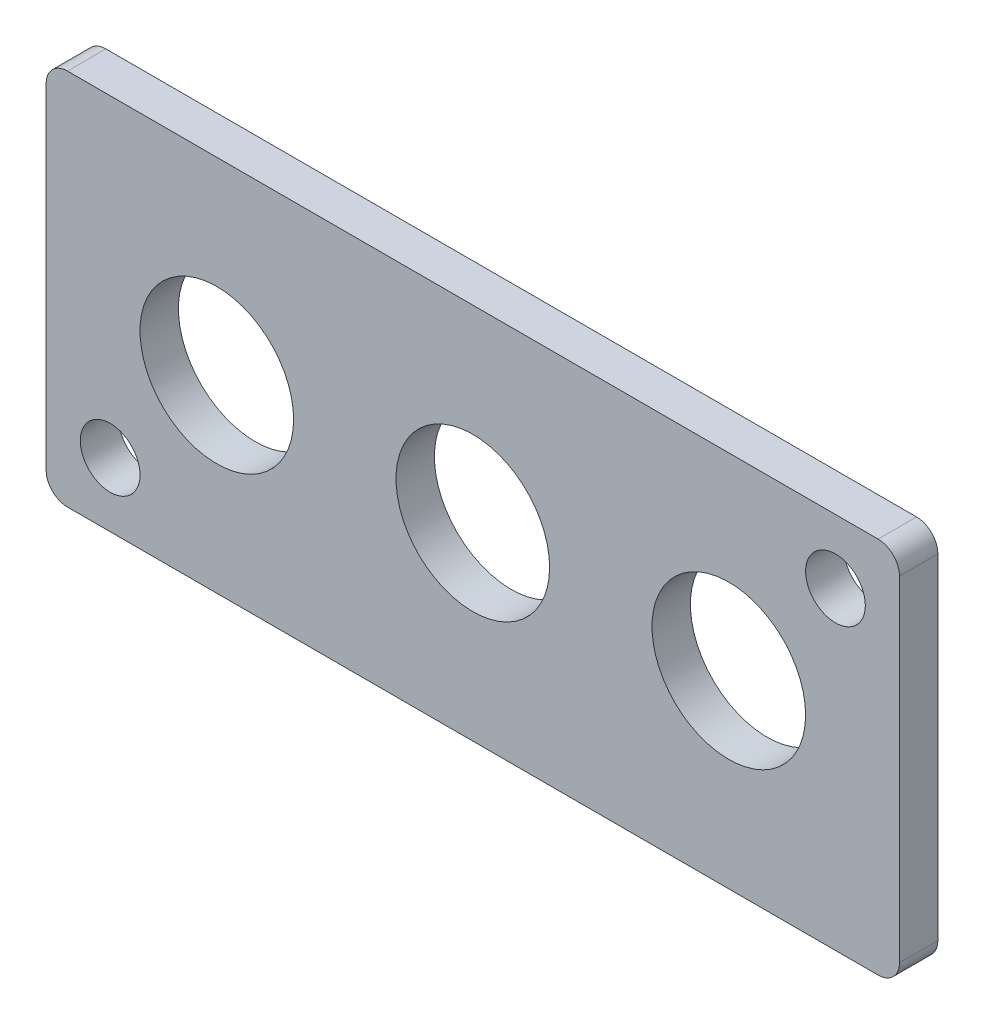
ISO-10303-21;
HEADER;
FILE_DESCRIPTION(('STEP AP214'),'2;1');
FILE_NAME('part.step','',(''),(''),'','','');
FILE_SCHEMA(('AUTOMOTIVE_DESIGN { 1 0 10303 214 1 1 1 1 }'));
ENDSEC;
DATA;
#1=APPLICATION_CONTEXT('core data for automotive mechanical design processes');
#2=APPLICATION_PROTOCOL_DEFINITION('international standard','automotive_design',2000,#1);
#3=PRODUCT_CONTEXT('',#1,'mechanical');
#4=PRODUCT('Part','Part','',(#3));
#5=PRODUCT_RELATED_PRODUCT_CATEGORY('part','',(#4));
#6=PRODUCT_DEFINITION_FORMATION('','',#4);
#7=PRODUCT_DEFINITION_CONTEXT('part definition',#1,'design');
#8=PRODUCT_DEFINITION('design','',#6,#7);
#9=PRODUCT_DEFINITION_SHAPE('','',#8);
#10=(LENGTH_UNIT() NAMED_UNIT(*) SI_UNIT(.MILLI.,.METRE.));
#11=(NAMED_UNIT(*) PLANE_ANGLE_UNIT() SI_UNIT($,.RADIAN.));
#12=(NAMED_UNIT(*) SI_UNIT($,.STERADIAN.) SOLID_ANGLE_UNIT());
#13=UNCERTAINTY_MEASURE_WITH_UNIT(LENGTH_MEASURE(1.E-05),#10,'distance_accuracy_value','');
#14=(GEOMETRIC_REPRESENTATION_CONTEXT(3) GLOBAL_UNCERTAINTY_ASSIGNED_CONTEXT((#13)) GLOBAL_UNIT_ASSIGNED_CONTEXT((#10,
#11,#12)) REPRESENTATION_CONTEXT('',''));
#15=CARTESIAN_POINT('',(0.,0.,0.));
#16=DIRECTION('',(0.,0.,1.));
#17=DIRECTION('',(1.,0.,0.));
#18=AXIS2_PLACEMENT_3D('',#15,#16,#17);
#19=CARTESIAN_POINT('',(52.,46.5,35.6));
#20=DIRECTION('',(0.,0.,-1.));
#21=DIRECTION('',(-1.,0.,0.));
#22=AXIS2_PLACEMENT_3D('',#19,#20,#21);
#23=CYLINDRICAL_SURFACE('',#22,1.);
#24=CARTESIAN_POINT('',(52.,46.5,33.8));
#25=DIRECTION('',(0.,0.,1.));
#26=DIRECTION('',(1.,0.,0.));
#27=AXIS2_PLACEMENT_3D('',#24,#25,#26);
#28=CIRCLE('',#27,1.);
#29=CARTESIAN_POINT('',(51.,46.5,33.8));
#30=VERTEX_POINT('',#29);
#31=CARTESIAN_POINT('',(52.,45.5,33.8));
#32=VERTEX_POINT('',#31);
#33=EDGE_CURVE('E136',#30,#32,#28,.T.);
#34=ORIENTED_EDGE('',*,*,#33,.T.);
#35=DIRECTION('',(0.,0.,-1.));
#36=VECTOR('',#35,1.);
#37=CARTESIAN_POINT('',(52.,45.5,35.6));
#38=LINE('',#37,#36);
#39=CARTESIAN_POINT('',(52.,45.5,35.6));
#40=VERTEX_POINT('',#39);
#41=EDGE_CURVE('E11',#40,#32,#38,.T.);
#42=ORIENTED_EDGE('',*,*,#41,.F.);
#43=CARTESIAN_POINT('',(52.,46.5,35.6));
#44=DIRECTION('',(0.,0.,1.));
#45=DIRECTION('',(1.,0.,0.));
#46=AXIS2_PLACEMENT_3D('',#43,#44,#45);
#47=CIRCLE('',#46,1.);
#48=CARTESIAN_POINT('',(51.,46.5,35.6));
#49=VERTEX_POINT('',#48);
#50=EDGE_CURVE('E153',#49,#40,#47,.T.);
#51=ORIENTED_EDGE('',*,*,#50,.F.);
#52=DIRECTION('',(0.,0.,-1.));
#53=VECTOR('',#52,1.);
#54=CARTESIAN_POINT('',(51.,46.5,35.6));
#55=LINE('',#54,#53);
#56=EDGE_CURVE('E131',#49,#30,#55,.T.);
#57=ORIENTED_EDGE('',*,*,#56,.T.);
#58=EDGE_LOOP('',(#34,#42,#51,#57));
#59=FACE_BOUND('',#58,.T.);
#60=ADVANCED_FACE('F41',(#59),#23,.T.);
#61=CARTESIAN_POINT('',(52.,45.5,35.6));
#62=DIRECTION('',(0.,1.,0.));
#63=DIRECTION('',(0.,0.,1.));
#64=AXIS2_PLACEMENT_3D('',#61,#62,#63);
#65=PLANE('',#64);
#66=DIRECTION('',(1.,0.,0.));
#67=VECTOR('',#66,1.);
#68=CARTESIAN_POINT('',(52.,45.5,33.8));
#69=LINE('',#68,#67);
#70=CARTESIAN_POINT('',(90.,45.5,33.8));
#71=VERTEX_POINT('',#70);
#72=EDGE_CURVE('E142',#32,#71,#69,.T.);
#73=ORIENTED_EDGE('',*,*,#72,.T.);
#74=DIRECTION('',(0.,0.,-1.));
#75=VECTOR('',#74,1.);
#76=CARTESIAN_POINT('',(90.,45.5,35.6));
#77=LINE('',#76,#75);
#78=CARTESIAN_POINT('',(90.,45.5,35.6));
#79=VERTEX_POINT('',#78);
#80=EDGE_CURVE('E49',#79,#71,#77,.T.);
#81=ORIENTED_EDGE('',*,*,#80,.F.);
#82=DIRECTION('',(1.,0.,0.));
#83=VECTOR('',#82,1.);
#84=CARTESIAN_POINT('',(52.,45.5,35.6));
#85=LINE('',#84,#83);
#86=EDGE_CURVE('E105',#40,#79,#85,.T.);
#87=ORIENTED_EDGE('',*,*,#86,.F.);
#88=ORIENTED_EDGE('',*,*,#41,.T.);
#89=EDGE_LOOP('',(#73,#81,#87,#88));
#90=FACE_BOUND('',#89,.T.);
#91=ADVANCED_FACE('F211',(#90),#65,.F.);
#92=CARTESIAN_POINT('',(90.,46.5,35.6));
#93=DIRECTION('',(0.,0.,-1.));
#94=DIRECTION('',(-1.,0.,0.));
#95=AXIS2_PLACEMENT_3D('',#92,#93,#94);
#96=CYLINDRICAL_SURFACE('',#95,1.);
#97=CARTESIAN_POINT('',(90.,46.5,33.8));
#98=DIRECTION('',(0.,0.,1.));
#99=DIRECTION('',(1.,0.,0.));
#100=AXIS2_PLACEMENT_3D('',#97,#98,#99);
#101=CIRCLE('',#100,1.);
#102=CARTESIAN_POINT('',(91.,46.5,33.8));
#103=VERTEX_POINT('',#102);
#104=EDGE_CURVE('E145',#71,#103,#101,.T.);
#105=ORIENTED_EDGE('',*,*,#104,.T.);
#106=DIRECTION('',(0.,0.,-1.));
#107=VECTOR('',#106,1.);
#108=CARTESIAN_POINT('',(91.,46.5,35.6));
#109=LINE('',#108,#107);
#110=CARTESIAN_POINT('',(91.,46.5,35.6));
#111=VERTEX_POINT('',#110);
#112=EDGE_CURVE('E159',#111,#103,#109,.T.);
#113=ORIENTED_EDGE('',*,*,#112,.F.);
#114=CARTESIAN_POINT('',(90.,46.5,35.6));
#115=DIRECTION('',(0.,0.,1.));
#116=DIRECTION('',(1.,0.,0.));
#117=AXIS2_PLACEMENT_3D('',#114,#115,#116);
#118=CIRCLE('',#117,1.);
#119=EDGE_CURVE('E322',#79,#111,#118,.T.);
#120=ORIENTED_EDGE('',*,*,#119,.F.);
#121=ORIENTED_EDGE('',*,*,#80,.T.);
#122=EDGE_LOOP('',(#105,#113,#120,#121));
#123=FACE_BOUND('',#122,.T.);
#124=ADVANCED_FACE('F214',(#123),#96,.T.);
#125=CARTESIAN_POINT('',(91.,46.5,35.6));
#126=DIRECTION('',(-1.,0.,0.));
#127=DIRECTION('',(0.,0.,1.));
#128=AXIS2_PLACEMENT_3D('',#125,#126,#127);
#129=PLANE('',#128);
#130=DIRECTION('',(0.,1.,0.));
#131=VECTOR('',#130,1.);
#132=CARTESIAN_POINT('',(91.,46.5,33.8));
#133=LINE('',#132,#131);
#134=CARTESIAN_POINT('',(91.,62.2,33.8));
#135=VERTEX_POINT('',#134);
#136=EDGE_CURVE('E148',#103,#135,#133,.T.);
#137=ORIENTED_EDGE('',*,*,#136,.T.);
#138=DIRECTION('',(0.,0.,-1.));
#139=VECTOR('',#138,1.);
#140=CARTESIAN_POINT('',(91.,62.2,35.6));
#141=LINE('',#140,#139);
#142=CARTESIAN_POINT('',(91.,62.2,35.6));
#143=VERTEX_POINT('',#142);
#144=EDGE_CURVE('E160',#143,#135,#141,.T.);
#145=ORIENTED_EDGE('',*,*,#144,.F.);
#146=DIRECTION('',(0.,1.,0.));
#147=VECTOR('',#146,1.);
#148=CARTESIAN_POINT('',(91.,46.5,35.6));
#149=LINE('',#148,#147);
#150=EDGE_CURVE('E326',#111,#143,#149,.T.);
#151=ORIENTED_EDGE('',*,*,#150,.F.);
#152=ORIENTED_EDGE('',*,*,#112,.T.);
#153=EDGE_LOOP('',(#137,#145,#151,#152));
#154=FACE_BOUND('',#153,.T.);
#155=ADVANCED_FACE('F218',(#154),#129,.F.);
#156=CARTESIAN_POINT('',(90.,62.2,35.6));
#157=DIRECTION('',(0.,0.,-1.));
#158=DIRECTION('',(-1.,0.,0.));
#159=AXIS2_PLACEMENT_3D('',#156,#157,#158);
#160=CYLINDRICAL_SURFACE('',#159,1.);
#161=CARTESIAN_POINT('',(90.,62.2,33.8));
#162=DIRECTION('',(0.,0.,1.));
#163=DIRECTION('',(1.,0.,0.));
#164=AXIS2_PLACEMENT_3D('',#161,#162,#163);
#165=CIRCLE('',#164,1.);
#166=CARTESIAN_POINT('',(90.,63.2,33.8));
#167=VERTEX_POINT('',#166);
#168=EDGE_CURVE('E146',#135,#167,#165,.T.);
#169=ORIENTED_EDGE('',*,*,#168,.T.);
#170=DIRECTION('',(0.,0.,-1.));
#171=VECTOR('',#170,1.);
#172=CARTESIAN_POINT('',(90.,63.2,35.6));
#173=LINE('',#172,#171);
#174=CARTESIAN_POINT('',(90.,63.2,35.6));
#175=VERTEX_POINT('',#174);
#176=EDGE_CURVE('E128',#175,#167,#173,.T.);
#177=ORIENTED_EDGE('',*,*,#176,.F.);
#178=CARTESIAN_POINT('',(90.,62.2,35.6));
#179=DIRECTION('',(0.,0.,1.));
#180=DIRECTION('',(1.,0.,0.));
#181=AXIS2_PLACEMENT_3D('',#178,#179,#180);
#182=CIRCLE('',#181,1.);
#183=EDGE_CURVE('E122',#143,#175,#182,.T.);
#184=ORIENTED_EDGE('',*,*,#183,.F.);
#185=ORIENTED_EDGE('',*,*,#144,.T.);
#186=EDGE_LOOP('',(#169,#177,#184,#185));
#187=FACE_BOUND('',#186,.T.);
#188=ADVANCED_FACE('F223',(#187),#160,.T.);
#189=CARTESIAN_POINT('',(90.,63.2,35.6));
#190=DIRECTION('',(0.,-1.,0.));
#191=DIRECTION('',(0.,0.,-1.));
#192=AXIS2_PLACEMENT_3D('',#189,#190,#191);
#193=PLANE('',#192);
#194=DIRECTION('',(-1.,0.,0.));
#195=VECTOR('',#194,1.);
#196=CARTESIAN_POINT('',(90.,63.2,33.8));
#197=LINE('',#196,#195);
#198=CARTESIAN_POINT('',(52.,63.2,33.8));
#199=VERTEX_POINT('',#198);
#200=EDGE_CURVE('E129',#167,#199,#197,.T.);
#201=ORIENTED_EDGE('',*,*,#200,.T.);
#202=DIRECTION('',(0.,0.,-1.));
#203=VECTOR('',#202,1.);
#204=CARTESIAN_POINT('',(52.,63.2,35.6));
#205=LINE('',#204,#203);
#206=CARTESIAN_POINT('',(52.,63.2,35.6));
#207=VERTEX_POINT('',#206);
#208=EDGE_CURVE('E127',#207,#199,#205,.T.);
#209=ORIENTED_EDGE('',*,*,#208,.F.);
#210=DIRECTION('',(-1.,0.,0.));
#211=VECTOR('',#210,1.);
#212=CARTESIAN_POINT('',(90.,63.2,35.6));
#213=LINE('',#212,#211);
#214=EDGE_CURVE('E113',#175,#207,#213,.T.);
#215=ORIENTED_EDGE('',*,*,#214,.F.);
#216=ORIENTED_EDGE('',*,*,#176,.T.);
#217=EDGE_LOOP('',(#201,#209,#215,#216));
#218=FACE_BOUND('',#217,.T.);
#219=ADVANCED_FACE('F130',(#218),#193,.F.);
#220=CARTESIAN_POINT('',(52.,62.2,35.6));
#221=DIRECTION('',(0.,0.,-1.));
#222=DIRECTION('',(-1.,0.,0.));
#223=AXIS2_PLACEMENT_3D('',#220,#221,#222);
#224=CYLINDRICAL_SURFACE('',#223,1.);
#225=CARTESIAN_POINT('',(52.,62.2,33.8));
#226=DIRECTION('',(0.,0.,1.));
#227=DIRECTION('',(1.,0.,0.));
#228=AXIS2_PLACEMENT_3D('',#225,#226,#227);
#229=CIRCLE('',#228,1.);
#230=CARTESIAN_POINT('',(51.,62.2,33.8));
#231=VERTEX_POINT('',#230);
#232=EDGE_CURVE('E86',#199,#231,#229,.T.);
#233=ORIENTED_EDGE('',*,*,#232,.T.);
#234=DIRECTION('',(0.,0.,-1.));
#235=VECTOR('',#234,1.);
#236=CARTESIAN_POINT('',(51.,62.2,35.6));
#237=LINE('',#236,#235);
#238=CARTESIAN_POINT('',(51.,62.2,35.6));
#239=VERTEX_POINT('',#238);
#240=EDGE_CURVE('E133',#239,#231,#237,.T.);
#241=ORIENTED_EDGE('',*,*,#240,.F.);
#242=CARTESIAN_POINT('',(52.,62.2,35.6));
#243=DIRECTION('',(0.,0.,1.));
#244=DIRECTION('',(1.,0.,0.));
#245=AXIS2_PLACEMENT_3D('',#242,#243,#244);
#246=CIRCLE('',#245,1.);
#247=EDGE_CURVE('E120',#207,#239,#246,.T.);
#248=ORIENTED_EDGE('',*,*,#247,.F.);
#249=ORIENTED_EDGE('',*,*,#208,.T.);
#250=EDGE_LOOP('',(#233,#241,#248,#249));
#251=FACE_BOUND('',#250,.T.);
#252=ADVANCED_FACE('F132',(#251),#224,.T.);
#253=CARTESIAN_POINT('',(51.,62.2,35.6));
#254=DIRECTION('',(1.,0.,0.));
#255=DIRECTION('',(0.,0.,-1.));
#256=AXIS2_PLACEMENT_3D('',#253,#254,#255);
#257=PLANE('',#256);
#258=DIRECTION('',(0.,-1.,0.));
#259=VECTOR('',#258,1.);
#260=CARTESIAN_POINT('',(51.,62.2,33.8));
#261=LINE('',#260,#259);
#262=EDGE_CURVE('E94',#231,#30,#261,.T.);
#263=ORIENTED_EDGE('',*,*,#262,.T.);
#264=ORIENTED_EDGE('',*,*,#56,.F.);
#265=DIRECTION('',(0.,-1.,0.));
#266=VECTOR('',#265,1.);
#267=CARTESIAN_POINT('',(51.,62.2,35.6));
#268=LINE('',#267,#266);
#269=EDGE_CURVE('E56',#239,#49,#268,.T.);
#270=ORIENTED_EDGE('',*,*,#269,.F.);
#271=ORIENTED_EDGE('',*,*,#240,.T.);
#272=EDGE_LOOP('',(#263,#264,#270,#271));
#273=FACE_BOUND('',#272,.T.);
#274=ADVANCED_FACE('F199',(#273),#257,.F.);
#275=CARTESIAN_POINT('',(52.,46.5,35.6));
#276=DIRECTION('',(0.,0.,1.));
#277=DIRECTION('',(1.,0.,0.));
#278=AXIS2_PLACEMENT_3D('',#275,#276,#277);
#279=PLANE('',#278);
#280=CARTESIAN_POINT('',(71.,54.355,35.6));
#281=DIRECTION('',(0.,0.,1.));
#282=DIRECTION('',(1.,0.,0.));
#283=AXIS2_PLACEMENT_3D('',#280,#281,#282);
#284=CIRCLE('',#283,3.60000000000001);
#285=CARTESIAN_POINT('',(74.6,54.355,35.6));
#286=VERTEX_POINT('',#285);
#287=EDGE_CURVE('E309',#286,#286,#284,.T.);
#288=ORIENTED_EDGE('',*,*,#287,.F.);
#289=EDGE_LOOP('',(#288));
#290=FACE_BOUND('',#289,.T.);
#291=CARTESIAN_POINT('',(83.,54.355,35.6));
#292=DIRECTION('',(0.,0.,1.));
#293=DIRECTION('',(1.,0.,0.));
#294=AXIS2_PLACEMENT_3D('',#291,#292,#293);
#295=CIRCLE('',#294,3.60000000000001);
#296=CARTESIAN_POINT('',(86.6,54.355,35.6));
#297=VERTEX_POINT('',#296);
#298=EDGE_CURVE('E313',#297,#297,#295,.T.);
#299=ORIENTED_EDGE('',*,*,#298,.F.);
#300=EDGE_LOOP('',(#299));
#301=FACE_BOUND('',#300,.T.);
#302=CARTESIAN_POINT('',(54.,48.5,35.6));
#303=DIRECTION('',(0.,0.,1.));
#304=DIRECTION('',(1.,0.,0.));
#305=AXIS2_PLACEMENT_3D('',#302,#303,#304);
#306=CIRCLE('',#305,1.4);
#307=CARTESIAN_POINT('',(55.4,48.5,35.6));
#308=VERTEX_POINT('',#307);
#309=EDGE_CURVE('E316',#308,#308,#306,.T.);
#310=ORIENTED_EDGE('',*,*,#309,.F.);
#311=EDGE_LOOP('',(#310));
#312=FACE_BOUND('',#311,.T.);
#313=CARTESIAN_POINT('',(88.,60.2,35.6));
#314=DIRECTION('',(0.,0.,1.));
#315=DIRECTION('',(1.,0.,0.));
#316=AXIS2_PLACEMENT_3D('',#313,#314,#315);
#317=CIRCLE('',#316,1.4);
#318=CARTESIAN_POINT('',(89.4,60.2,35.6));
#319=VERTEX_POINT('',#318);
#320=EDGE_CURVE('E317',#319,#319,#317,.T.);
#321=ORIENTED_EDGE('',*,*,#320,.F.);
#322=EDGE_LOOP('',(#321));
#323=FACE_BOUND('',#322,.T.);
#324=CARTESIAN_POINT('',(59.,54.355,35.6));
#325=DIRECTION('',(0.,0.,1.));
#326=DIRECTION('',(1.,0.,0.));
#327=AXIS2_PLACEMENT_3D('',#324,#325,#326);
#328=CIRCLE('',#327,3.60000000000001);
#329=CARTESIAN_POINT('',(62.6,54.355,35.6));
#330=VERTEX_POINT('',#329);
#331=EDGE_CURVE('E166',#330,#330,#328,.T.);
#332=ORIENTED_EDGE('',*,*,#331,.F.);
#333=EDGE_LOOP('',(#332));
#334=FACE_BOUND('',#333,.T.);
#335=ORIENTED_EDGE('',*,*,#50,.T.);
#336=ORIENTED_EDGE('',*,*,#86,.T.);
#337=ORIENTED_EDGE('',*,*,#119,.T.);
#338=ORIENTED_EDGE('',*,*,#150,.T.);
#339=ORIENTED_EDGE('',*,*,#183,.T.);
#340=ORIENTED_EDGE('',*,*,#214,.T.);
#341=ORIENTED_EDGE('',*,*,#247,.T.);
#342=ORIENTED_EDGE('',*,*,#269,.T.);
#343=EDGE_LOOP('',(#335,#336,#337,#338,#339,#340,#341,#342));
#344=FACE_BOUND('',#343,.T.);
#345=ADVANCED_FACE('F119',(#290,#301,#312,#323,#334,#344),#279,.T.);
#346=CARTESIAN_POINT('',(52.,46.5,33.8));
#347=DIRECTION('',(0.,0.,1.));
#348=DIRECTION('',(1.,0.,0.));
#349=AXIS2_PLACEMENT_3D('',#346,#347,#348);
#350=PLANE('',#349);
#351=CARTESIAN_POINT('',(71.,54.355,33.8));
#352=DIRECTION('',(0.,0.,1.));
#353=DIRECTION('',(1.,0.,0.));
#354=AXIS2_PLACEMENT_3D('',#351,#352,#353);
#355=CIRCLE('',#354,3.60000000000001);
#356=CARTESIAN_POINT('',(74.6,54.355,33.8));
#357=VERTEX_POINT('',#356);
#358=EDGE_CURVE('E42',#357,#357,#355,.F.);
#359=ORIENTED_EDGE('',*,*,#358,.F.);
#360=EDGE_LOOP('',(#359));
#361=FACE_BOUND('',#360,.T.);
#362=CARTESIAN_POINT('',(83.,54.355,33.8));
#363=DIRECTION('',(0.,0.,1.));
#364=DIRECTION('',(1.,0.,0.));
#365=AXIS2_PLACEMENT_3D('',#362,#363,#364);
#366=CIRCLE('',#365,3.60000000000001);
#367=CARTESIAN_POINT('',(86.6,54.355,33.8));
#368=VERTEX_POINT('',#367);
#369=EDGE_CURVE('E175',#368,#368,#366,.F.);
#370=ORIENTED_EDGE('',*,*,#369,.F.);
#371=EDGE_LOOP('',(#370));
#372=FACE_BOUND('',#371,.T.);
#373=CARTESIAN_POINT('',(54.,48.5,33.8));
#374=DIRECTION('',(0.,0.,1.));
#375=DIRECTION('',(1.,0.,0.));
#376=AXIS2_PLACEMENT_3D('',#373,#374,#375);
#377=CIRCLE('',#376,1.4);
#378=CARTESIAN_POINT('',(55.4,48.5,33.8));
#379=VERTEX_POINT('',#378);
#380=EDGE_CURVE('E174',#379,#379,#377,.F.);
#381=ORIENTED_EDGE('',*,*,#380,.F.);
#382=EDGE_LOOP('',(#381));
#383=FACE_BOUND('',#382,.T.);
#384=CARTESIAN_POINT('',(88.,60.2,33.8));
#385=DIRECTION('',(0.,0.,1.));
#386=DIRECTION('',(1.,0.,0.));
#387=AXIS2_PLACEMENT_3D('',#384,#385,#386);
#388=CIRCLE('',#387,1.4);
#389=CARTESIAN_POINT('',(89.4,60.2,33.8));
#390=VERTEX_POINT('',#389);
#391=EDGE_CURVE('E169',#390,#390,#388,.F.);
#392=ORIENTED_EDGE('',*,*,#391,.F.);
#393=EDGE_LOOP('',(#392));
#394=FACE_BOUND('',#393,.T.);
#395=CARTESIAN_POINT('',(59.,54.355,33.8));
#396=DIRECTION('',(0.,0.,1.));
#397=DIRECTION('',(1.,0.,0.));
#398=AXIS2_PLACEMENT_3D('',#395,#396,#397);
#399=CIRCLE('',#398,3.60000000000001);
#400=CARTESIAN_POINT('',(62.6,54.355,33.8));
#401=VERTEX_POINT('',#400);
#402=EDGE_CURVE('E164',#401,#401,#399,.F.);
#403=ORIENTED_EDGE('',*,*,#402,.F.);
#404=EDGE_LOOP('',(#403));
#405=FACE_BOUND('',#404,.T.);
#406=ORIENTED_EDGE('',*,*,#33,.F.);
#407=ORIENTED_EDGE('',*,*,#262,.F.);
#408=ORIENTED_EDGE('',*,*,#232,.F.);
#409=ORIENTED_EDGE('',*,*,#200,.F.);
#410=ORIENTED_EDGE('',*,*,#168,.F.);
#411=ORIENTED_EDGE('',*,*,#136,.F.);
#412=ORIENTED_EDGE('',*,*,#104,.F.);
#413=ORIENTED_EDGE('',*,*,#72,.F.);
#414=EDGE_LOOP('',(#406,#407,#408,#409,#410,#411,#412,#413));
#415=FACE_BOUND('',#414,.T.);
#416=ADVANCED_FACE('F181',(#361,#372,#383,#394,#405,#415),#350,.F.);
#417=CARTESIAN_POINT('',(59.,54.355,33.8));
#418=DIRECTION('',(0.,0.,-1.));
#419=DIRECTION('',(-1.,0.,0.));
#420=AXIS2_PLACEMENT_3D('',#417,#418,#419);
#421=CYLINDRICAL_SURFACE('',#420,3.60000000000001);
#422=ORIENTED_EDGE('',*,*,#331,.T.);
#423=EDGE_LOOP('',(#422));
#424=FACE_BOUND('',#423,.T.);
#425=ORIENTED_EDGE('',*,*,#402,.T.);
#426=EDGE_LOOP('',(#425));
#427=FACE_BOUND('',#426,.T.);
#428=ADVANCED_FACE('F188',(#424,#427),#421,.F.);
#429=CARTESIAN_POINT('',(88.,60.2,33.8));
#430=DIRECTION('',(0.,0.,-1.));
#431=DIRECTION('',(-1.,0.,0.));
#432=AXIS2_PLACEMENT_3D('',#429,#430,#431);
#433=CYLINDRICAL_SURFACE('',#432,1.4);
#434=ORIENTED_EDGE('',*,*,#320,.T.);
#435=EDGE_LOOP('',(#434));
#436=FACE_BOUND('',#435,.T.);
#437=ORIENTED_EDGE('',*,*,#391,.T.);
#438=EDGE_LOOP('',(#437));
#439=FACE_BOUND('',#438,.T.);
#440=ADVANCED_FACE('F266',(#436,#439),#433,.F.);
#441=CARTESIAN_POINT('',(54.,48.5,33.8));
#442=DIRECTION('',(0.,0.,-1.));
#443=DIRECTION('',(-1.,0.,0.));
#444=AXIS2_PLACEMENT_3D('',#441,#442,#443);
#445=CYLINDRICAL_SURFACE('',#444,1.4);
#446=ORIENTED_EDGE('',*,*,#309,.T.);
#447=EDGE_LOOP('',(#446));
#448=FACE_BOUND('',#447,.T.);
#449=ORIENTED_EDGE('',*,*,#380,.T.);
#450=EDGE_LOOP('',(#449));
#451=FACE_BOUND('',#450,.T.);
#452=ADVANCED_FACE('F277',(#448,#451),#445,.F.);
#453=CARTESIAN_POINT('',(83.,54.355,33.8));
#454=DIRECTION('',(0.,0.,-1.));
#455=DIRECTION('',(-1.,0.,0.));
#456=AXIS2_PLACEMENT_3D('',#453,#454,#455);
#457=CYLINDRICAL_SURFACE('',#456,3.60000000000001);
#458=ORIENTED_EDGE('',*,*,#298,.T.);
#459=EDGE_LOOP('',(#458));
#460=FACE_BOUND('',#459,.T.);
#461=ORIENTED_EDGE('',*,*,#369,.T.);
#462=EDGE_LOOP('',(#461));
#463=FACE_BOUND('',#462,.T.);
#464=ADVANCED_FACE('F287',(#460,#463),#457,.F.);
#465=CARTESIAN_POINT('',(71.,54.355,33.8));
#466=DIRECTION('',(0.,0.,-1.));
#467=DIRECTION('',(-1.,0.,0.));
#468=AXIS2_PLACEMENT_3D('',#465,#466,#467);
#469=CYLINDRICAL_SURFACE('',#468,3.60000000000001);
#470=ORIENTED_EDGE('',*,*,#287,.T.);
#471=EDGE_LOOP('',(#470));
#472=FACE_BOUND('',#471,.T.);
#473=ORIENTED_EDGE('',*,*,#358,.T.);
#474=EDGE_LOOP('',(#473));
#475=FACE_BOUND('',#474,.T.);
#476=ADVANCED_FACE('F182',(#472,#475),#469,.F.);
#477=CLOSED_SHELL('',(#60,#91,#124,#155,#188,#219,#252,#274,#345,#416,#428,#440,#452,#464,#476));
#478=MANIFOLD_SOLID_BREP('B2',#477);
#479=ADVANCED_BREP_SHAPE_REPRESENTATION('',(#18,#478),#14);
#480=SHAPE_DEFINITION_REPRESENTATION(#9,#479);
ENDSEC;
END-ISO-10303-21;
